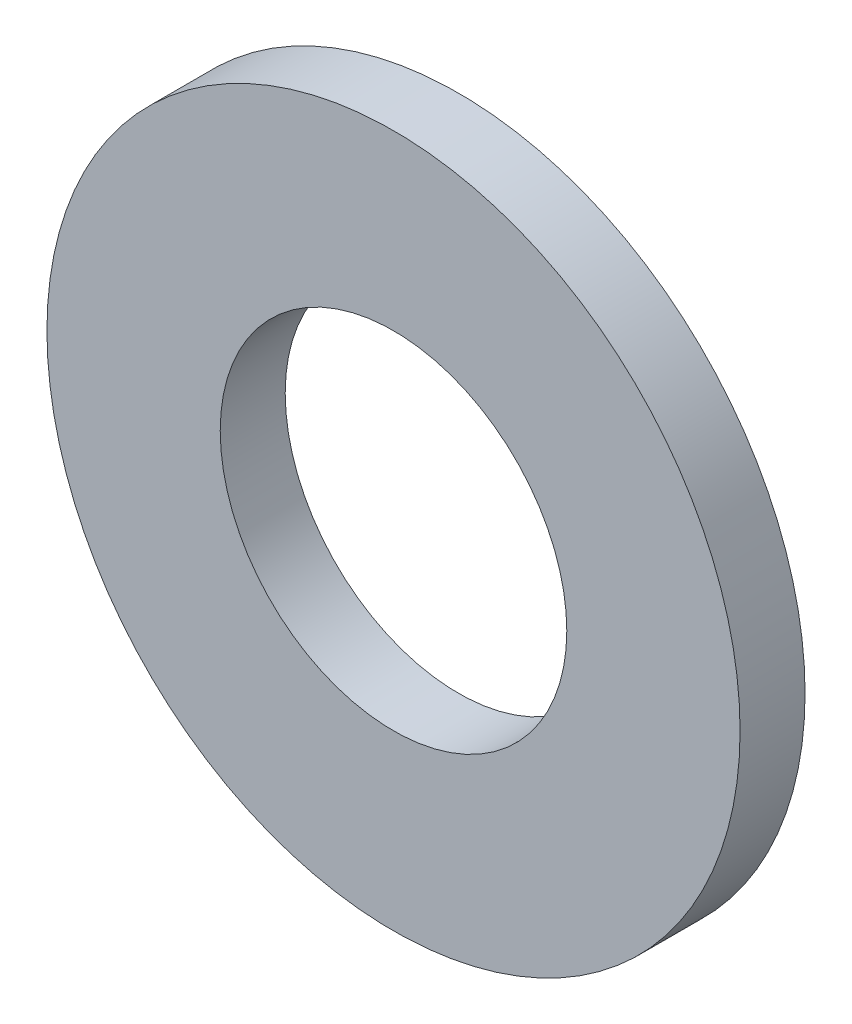
ISO-10303-21;
HEADER;
FILE_DESCRIPTION(('STEP AP214'),'2;1');
FILE_NAME('part.step','',(''),(''),'','','');
FILE_SCHEMA(('AUTOMOTIVE_DESIGN { 1 0 10303 214 1 1 1 1 }'));
ENDSEC;
DATA;
#1=APPLICATION_CONTEXT('core data for automotive mechanical design processes');
#2=APPLICATION_PROTOCOL_DEFINITION('international standard','automotive_design',2000,#1);
#3=PRODUCT_CONTEXT('',#1,'mechanical');
#4=PRODUCT('Part','Part','',(#3));
#5=PRODUCT_RELATED_PRODUCT_CATEGORY('part','',(#4));
#6=PRODUCT_DEFINITION_FORMATION('','',#4);
#7=PRODUCT_DEFINITION_CONTEXT('part definition',#1,'design');
#8=PRODUCT_DEFINITION('design','',#6,#7);
#9=PRODUCT_DEFINITION_SHAPE('','',#8);
#10=(LENGTH_UNIT() NAMED_UNIT(*) SI_UNIT(.MILLI.,.METRE.));
#11=(NAMED_UNIT(*) PLANE_ANGLE_UNIT() SI_UNIT($,.RADIAN.));
#12=(NAMED_UNIT(*) SI_UNIT($,.STERADIAN.) SOLID_ANGLE_UNIT());
#13=UNCERTAINTY_MEASURE_WITH_UNIT(LENGTH_MEASURE(1.E-05),#10,'distance_accuracy_value','');
#14=(GEOMETRIC_REPRESENTATION_CONTEXT(3) GLOBAL_UNCERTAINTY_ASSIGNED_CONTEXT((#13)) GLOBAL_UNIT_ASSIGNED_CONTEXT((#10,
#11,#12)) REPRESENTATION_CONTEXT('',''));
#15=CARTESIAN_POINT('',(0.,0.,0.));
#16=DIRECTION('',(0.,0.,1.));
#17=DIRECTION('',(1.,0.,0.));
#18=AXIS2_PLACEMENT_3D('',#15,#16,#17);
#19=CARTESIAN_POINT('',(0.,0.,1.5));
#20=DIRECTION('',(0.,0.,1.));
#21=DIRECTION('',(1.,0.,0.));
#22=AXIS2_PLACEMENT_3D('',#19,#20,#21);
#23=PLANE('',#22);
#24=CARTESIAN_POINT('',(0.,0.,1.5));
#25=DIRECTION('',(0.,0.,1.));
#26=DIRECTION('',(1.,0.,0.));
#27=AXIS2_PLACEMENT_3D('',#24,#25,#26);
#28=CIRCLE('',#27,8.);
#29=CARTESIAN_POINT('',(8.,0.,1.5));
#30=VERTEX_POINT('',#29);
#31=EDGE_CURVE('E10',#30,#30,#28,.T.);
#32=ORIENTED_EDGE('',*,*,#31,.T.);
#33=EDGE_LOOP('',(#32));
#34=FACE_BOUND('',#33,.T.);
#35=CARTESIAN_POINT('',(0.,0.,1.5));
#36=DIRECTION('',(0.,0.,1.));
#37=DIRECTION('',(1.,0.,0.));
#38=AXIS2_PLACEMENT_3D('',#35,#36,#37);
#39=CIRCLE('',#38,4.);
#40=CARTESIAN_POINT('',(4.,0.,1.5));
#41=VERTEX_POINT('',#40);
#42=EDGE_CURVE('E41',#41,#41,#39,.T.);
#43=ORIENTED_EDGE('',*,*,#42,.F.);
#44=EDGE_LOOP('',(#43));
#45=FACE_BOUND('',#44,.T.);
#46=ADVANCED_FACE('F30',(#34,#45),#23,.T.);
#47=CARTESIAN_POINT('',(0.,0.,0.));
#48=DIRECTION('',(0.,0.,1.));
#49=DIRECTION('',(1.,0.,0.));
#50=AXIS2_PLACEMENT_3D('',#47,#48,#49);
#51=PLANE('',#50);
#52=CARTESIAN_POINT('',(0.,0.,0.));
#53=DIRECTION('',(0.,0.,1.));
#54=DIRECTION('',(1.,0.,0.));
#55=AXIS2_PLACEMENT_3D('',#52,#53,#54);
#56=CIRCLE('',#55,8.);
#57=CARTESIAN_POINT('',(8.,0.,0.));
#58=VERTEX_POINT('',#57);
#59=EDGE_CURVE('E34',#58,#58,#56,.T.);
#60=ORIENTED_EDGE('',*,*,#59,.F.);
#61=EDGE_LOOP('',(#60));
#62=FACE_BOUND('',#61,.T.);
#63=CARTESIAN_POINT('',(0.,0.,0.));
#64=DIRECTION('',(0.,0.,1.));
#65=DIRECTION('',(1.,0.,0.));
#66=AXIS2_PLACEMENT_3D('',#63,#64,#65);
#67=CIRCLE('',#66,4.);
#68=CARTESIAN_POINT('',(4.,0.,0.));
#69=VERTEX_POINT('',#68);
#70=EDGE_CURVE('E43',#69,#69,#67,.T.);
#71=ORIENTED_EDGE('',*,*,#70,.T.);
#72=EDGE_LOOP('',(#71));
#73=FACE_BOUND('',#72,.T.);
#74=ADVANCED_FACE('F53',(#62,#73),#51,.F.);
#75=CARTESIAN_POINT('',(0.,0.,1.5));
#76=DIRECTION('',(0.,0.,-1.));
#77=DIRECTION('',(-1.,0.,0.));
#78=AXIS2_PLACEMENT_3D('',#75,#76,#77);
#79=CYLINDRICAL_SURFACE('',#78,8.);
#80=ORIENTED_EDGE('',*,*,#31,.F.);
#81=EDGE_LOOP('',(#80));
#82=FACE_BOUND('',#81,.T.);
#83=ORIENTED_EDGE('',*,*,#59,.T.);
#84=EDGE_LOOP('',(#83));
#85=FACE_BOUND('',#84,.T.);
#86=ADVANCED_FACE('F32',(#82,#85),#79,.T.);
#87=CARTESIAN_POINT('',(0.,0.,1.5));
#88=DIRECTION('',(0.,0.,-1.));
#89=DIRECTION('',(-1.,0.,0.));
#90=AXIS2_PLACEMENT_3D('',#87,#88,#89);
#91=CYLINDRICAL_SURFACE('',#90,4.);
#92=ORIENTED_EDGE('',*,*,#42,.T.);
#93=EDGE_LOOP('',(#92));
#94=FACE_BOUND('',#93,.T.);
#95=ORIENTED_EDGE('',*,*,#70,.F.);
#96=EDGE_LOOP('',(#95));
#97=FACE_BOUND('',#96,.T.);
#98=ADVANCED_FACE('F49',(#94,#97),#91,.F.);
#99=CLOSED_SHELL('',(#46,#74,#86,#98));
#100=MANIFOLD_SOLID_BREP('B2',#99);
#101=ADVANCED_BREP_SHAPE_REPRESENTATION('',(#18,#100),#14);
#102=SHAPE_DEFINITION_REPRESENTATION(#9,#101);
ENDSEC;
END-ISO-10303-21;
